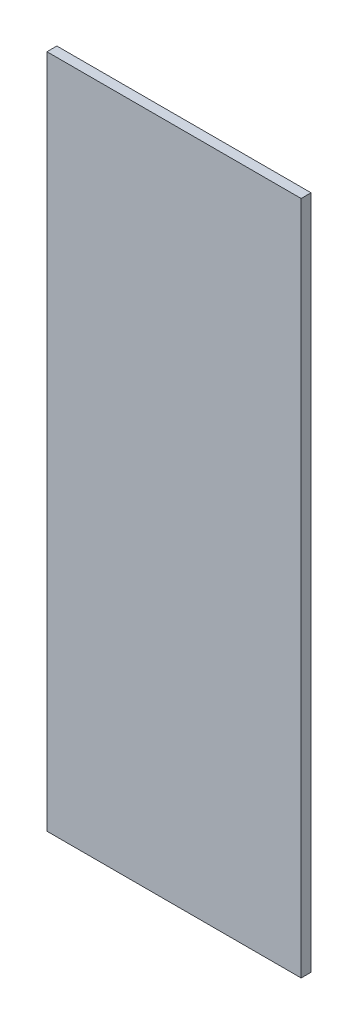
ISO-10303-21;
HEADER;
FILE_DESCRIPTION(('STEP AP214'),'2;1');
FILE_NAME('part.step','',(''),(''),'','','');
FILE_SCHEMA(('AUTOMOTIVE_DESIGN { 1 0 10303 214 1 1 1 1 }'));
ENDSEC;
DATA;
#1=APPLICATION_CONTEXT('core data for automotive mechanical design processes');
#2=APPLICATION_PROTOCOL_DEFINITION('international standard','automotive_design',2000,#1);
#3=PRODUCT_CONTEXT('',#1,'mechanical');
#4=PRODUCT('Part','Part','',(#3));
#5=PRODUCT_RELATED_PRODUCT_CATEGORY('part','',(#4));
#6=PRODUCT_DEFINITION_FORMATION('','',#4);
#7=PRODUCT_DEFINITION_CONTEXT('part definition',#1,'design');
#8=PRODUCT_DEFINITION('design','',#6,#7);
#9=PRODUCT_DEFINITION_SHAPE('','',#8);
#10=(LENGTH_UNIT() NAMED_UNIT(*) SI_UNIT(.MILLI.,.METRE.));
#11=(NAMED_UNIT(*) PLANE_ANGLE_UNIT() SI_UNIT($,.RADIAN.));
#12=(NAMED_UNIT(*) SI_UNIT($,.STERADIAN.) SOLID_ANGLE_UNIT());
#13=UNCERTAINTY_MEASURE_WITH_UNIT(LENGTH_MEASURE(1.E-05),#10,'distance_accuracy_value','');
#14=(GEOMETRIC_REPRESENTATION_CONTEXT(3) GLOBAL_UNCERTAINTY_ASSIGNED_CONTEXT((#13)) GLOBAL_UNIT_ASSIGNED_CONTEXT((#10,
#11,#12)) REPRESENTATION_CONTEXT('',''));
#15=CARTESIAN_POINT('',(0.,0.,0.));
#16=DIRECTION('',(0.,0.,1.));
#17=DIRECTION('',(1.,0.,0.));
#18=AXIS2_PLACEMENT_3D('',#15,#16,#17);
#19=CARTESIAN_POINT('',(-26.9543430602269,27.7940422209816,2.));
#20=DIRECTION('',(1.,0.,0.));
#21=DIRECTION('',(0.,1.,0.));
#22=AXIS2_PLACEMENT_3D('',#19,#20,#21);
#23=PLANE('',#22);
#24=DIRECTION('',(0.,-1.,0.));
#25=VECTOR('',#24,1.);
#26=CARTESIAN_POINT('',(-26.9543430602269,27.7940422209816,0.));
#27=LINE('',#26,#25);
#28=CARTESIAN_POINT('',(-26.9543430602269,27.7940422209816,0.));
#29=VERTEX_POINT('',#28);
#30=CARTESIAN_POINT('',(-26.9543430602268,-108.535957779018,0.));
#31=VERTEX_POINT('',#30);
#32=EDGE_CURVE('E103',#29,#31,#27,.T.);
#33=ORIENTED_EDGE('',*,*,#32,.T.);
#34=DIRECTION('',(0.,0.,-1.));
#35=VECTOR('',#34,1.);
#36=CARTESIAN_POINT('',(-26.9543430602268,-108.535957779018,2.));
#37=LINE('',#36,#35);
#38=CARTESIAN_POINT('',(-26.9543430602268,-108.535957779018,2.));
#39=VERTEX_POINT('',#38);
#40=EDGE_CURVE('E11',#39,#31,#37,.T.);
#41=ORIENTED_EDGE('',*,*,#40,.F.);
#42=DIRECTION('',(0.,-1.,0.));
#43=VECTOR('',#42,1.);
#44=CARTESIAN_POINT('',(-26.9543430602269,27.7940422209816,2.));
#45=LINE('',#44,#43);
#46=CARTESIAN_POINT('',(-26.9543430602269,27.7940422209816,2.));
#47=VERTEX_POINT('',#46);
#48=EDGE_CURVE('E91',#47,#39,#45,.T.);
#49=ORIENTED_EDGE('',*,*,#48,.F.);
#50=DIRECTION('',(0.,0.,-1.));
#51=VECTOR('',#50,1.);
#52=CARTESIAN_POINT('',(-26.9543430602269,27.7940422209816,2.));
#53=LINE('',#52,#51);
#54=EDGE_CURVE('E99',#47,#29,#53,.T.);
#55=ORIENTED_EDGE('',*,*,#54,.T.);
#56=EDGE_LOOP('',(#33,#41,#49,#55));
#57=FACE_BOUND('',#56,.T.);
#58=ADVANCED_FACE('F40',(#57),#23,.F.);
#59=CARTESIAN_POINT('',(-26.9543430602268,-108.535957779018,2.));
#60=DIRECTION('',(0.,1.,0.));
#61=DIRECTION('',(0.,0.,1.));
#62=AXIS2_PLACEMENT_3D('',#59,#60,#61);
#63=PLANE('',#62);
#64=DIRECTION('',(1.,0.,0.));
#65=VECTOR('',#64,1.);
#66=CARTESIAN_POINT('',(-26.9543430602268,-108.535957779018,0.));
#67=LINE('',#66,#65);
#68=CARTESIAN_POINT('',(24.3780552567437,-108.535957779018,0.));
#69=VERTEX_POINT('',#68);
#70=EDGE_CURVE('E95',#31,#69,#67,.T.);
#71=ORIENTED_EDGE('',*,*,#70,.T.);
#72=DIRECTION('',(0.,0.,-1.));
#73=VECTOR('',#72,1.);
#74=CARTESIAN_POINT('',(24.3780552567437,-108.535957779018,2.));
#75=LINE('',#74,#73);
#76=CARTESIAN_POINT('',(24.3780552567437,-108.535957779018,2.));
#77=VERTEX_POINT('',#76);
#78=EDGE_CURVE('E48',#77,#69,#75,.T.);
#79=ORIENTED_EDGE('',*,*,#78,.F.);
#80=DIRECTION('',(1.,0.,0.));
#81=VECTOR('',#80,1.);
#82=CARTESIAN_POINT('',(-26.9543430602268,-108.535957779018,2.));
#83=LINE('',#82,#81);
#84=EDGE_CURVE('E86',#39,#77,#83,.T.);
#85=ORIENTED_EDGE('',*,*,#84,.F.);
#86=ORIENTED_EDGE('',*,*,#40,.T.);
#87=EDGE_LOOP('',(#71,#79,#85,#86));
#88=FACE_BOUND('',#87,.T.);
#89=ADVANCED_FACE('F94',(#88),#63,.F.);
#90=CARTESIAN_POINT('',(24.3780552567437,27.7940422209816,2.));
#91=DIRECTION('',(-1.,0.,0.));
#92=DIRECTION('',(0.,-1.,0.));
#93=AXIS2_PLACEMENT_3D('',#90,#91,#92);
#94=PLANE('',#93);
#95=DIRECTION('',(0.,1.,0.));
#96=VECTOR('',#95,1.);
#97=CARTESIAN_POINT('',(24.3780552567437,27.7940422209816,0.));
#98=LINE('',#97,#96);
#99=CARTESIAN_POINT('',(24.3780552567437,27.7940422209816,0.));
#100=VERTEX_POINT('',#99);
#101=EDGE_CURVE('E73',#69,#100,#98,.T.);
#102=ORIENTED_EDGE('',*,*,#101,.T.);
#103=DIRECTION('',(0.,0.,-1.));
#104=VECTOR('',#103,1.);
#105=CARTESIAN_POINT('',(24.3780552567437,27.7940422209816,2.));
#106=LINE('',#105,#104);
#107=CARTESIAN_POINT('',(24.3780552567437,27.7940422209816,2.));
#108=VERTEX_POINT('',#107);
#109=EDGE_CURVE('E96',#108,#100,#106,.T.);
#110=ORIENTED_EDGE('',*,*,#109,.F.);
#111=DIRECTION('',(0.,1.,0.));
#112=VECTOR('',#111,1.);
#113=CARTESIAN_POINT('',(24.3780552567437,27.7940422209816,2.));
#114=LINE('',#113,#112);
#115=EDGE_CURVE('E89',#77,#108,#114,.T.);
#116=ORIENTED_EDGE('',*,*,#115,.F.);
#117=ORIENTED_EDGE('',*,*,#78,.T.);
#118=EDGE_LOOP('',(#102,#110,#116,#117));
#119=FACE_BOUND('',#118,.T.);
#120=ADVANCED_FACE('F97',(#119),#94,.F.);
#121=CARTESIAN_POINT('',(-26.9543430602269,27.7940422209816,2.));
#122=DIRECTION('',(0.,-1.,0.));
#123=DIRECTION('',(0.,0.,-1.));
#124=AXIS2_PLACEMENT_3D('',#121,#122,#123);
#125=PLANE('',#124);
#126=DIRECTION('',(-1.,0.,0.));
#127=VECTOR('',#126,1.);
#128=CARTESIAN_POINT('',(-26.9543430602269,27.7940422209816,0.));
#129=LINE('',#128,#127);
#130=EDGE_CURVE('E79',#100,#29,#129,.T.);
#131=ORIENTED_EDGE('',*,*,#130,.T.);
#132=ORIENTED_EDGE('',*,*,#54,.F.);
#133=DIRECTION('',(-1.,0.,0.));
#134=VECTOR('',#133,1.);
#135=CARTESIAN_POINT('',(-26.9543430602269,27.7940422209816,2.));
#136=LINE('',#135,#134);
#137=EDGE_CURVE('E56',#108,#47,#136,.T.);
#138=ORIENTED_EDGE('',*,*,#137,.F.);
#139=ORIENTED_EDGE('',*,*,#109,.T.);
#140=EDGE_LOOP('',(#131,#132,#138,#139));
#141=FACE_BOUND('',#140,.T.);
#142=ADVANCED_FACE('F110',(#141),#125,.F.);
#143=CARTESIAN_POINT('',(0.,0.,2.));
#144=DIRECTION('',(0.,0.,1.));
#145=DIRECTION('',(1.,0.,0.));
#146=AXIS2_PLACEMENT_3D('',#143,#144,#145);
#147=PLANE('',#146);
#148=ORIENTED_EDGE('',*,*,#48,.T.);
#149=ORIENTED_EDGE('',*,*,#84,.T.);
#150=ORIENTED_EDGE('',*,*,#115,.T.);
#151=ORIENTED_EDGE('',*,*,#137,.T.);
#152=EDGE_LOOP('',(#148,#149,#150,#151));
#153=FACE_BOUND('',#152,.T.);
#154=ADVANCED_FACE('F87',(#153),#147,.T.);
#155=CARTESIAN_POINT('',(0.,0.,0.));
#156=DIRECTION('',(0.,0.,1.));
#157=DIRECTION('',(1.,0.,0.));
#158=AXIS2_PLACEMENT_3D('',#155,#156,#157);
#159=PLANE('',#158);
#160=ORIENTED_EDGE('',*,*,#32,.F.);
#161=ORIENTED_EDGE('',*,*,#130,.F.);
#162=ORIENTED_EDGE('',*,*,#101,.F.);
#163=ORIENTED_EDGE('',*,*,#70,.F.);
#164=EDGE_LOOP('',(#160,#161,#162,#163));
#165=FACE_BOUND('',#164,.T.);
#166=ADVANCED_FACE('F113',(#165),#159,.F.);
#167=CLOSED_SHELL('',(#58,#89,#120,#142,#154,#166));
#168=MANIFOLD_SOLID_BREP('B2',#167);
#169=ADVANCED_BREP_SHAPE_REPRESENTATION('',(#18,#168),#14);
#170=SHAPE_DEFINITION_REPRESENTATION(#9,#169);
ENDSEC;
END-ISO-10303-21;
